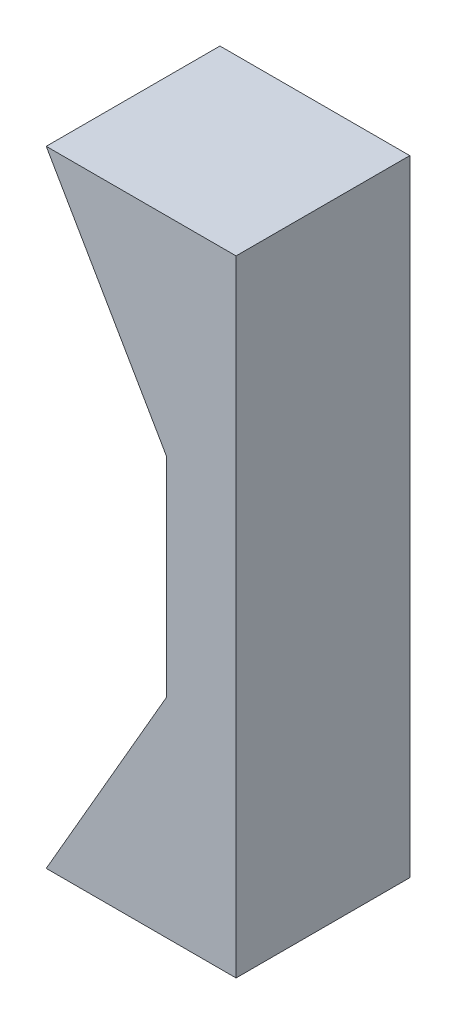
ISO-10303-21;
HEADER;
FILE_DESCRIPTION(('STEP AP214'),'2;1');
FILE_NAME('part.step','',(''),(''),'','','');
FILE_SCHEMA(('AUTOMOTIVE_DESIGN { 1 0 10303 214 1 1 1 1 }'));
ENDSEC;
DATA;
#1=APPLICATION_CONTEXT('core data for automotive mechanical design processes');
#2=APPLICATION_PROTOCOL_DEFINITION('international standard','automotive_design',2000,#1);
#3=PRODUCT_CONTEXT('',#1,'mechanical');
#4=PRODUCT('Part','Part','',(#3));
#5=PRODUCT_RELATED_PRODUCT_CATEGORY('part','',(#4));
#6=PRODUCT_DEFINITION_FORMATION('','',#4);
#7=PRODUCT_DEFINITION_CONTEXT('part definition',#1,'design');
#8=PRODUCT_DEFINITION('design','',#6,#7);
#9=PRODUCT_DEFINITION_SHAPE('','',#8);
#10=(LENGTH_UNIT() NAMED_UNIT(*) SI_UNIT(.MILLI.,.METRE.));
#11=(NAMED_UNIT(*) PLANE_ANGLE_UNIT() SI_UNIT($,.RADIAN.));
#12=(NAMED_UNIT(*) SI_UNIT($,.STERADIAN.) SOLID_ANGLE_UNIT());
#13=UNCERTAINTY_MEASURE_WITH_UNIT(LENGTH_MEASURE(1.E-05),#10,'distance_accuracy_value','');
#14=(GEOMETRIC_REPRESENTATION_CONTEXT(3) GLOBAL_UNCERTAINTY_ASSIGNED_CONTEXT((#13)) GLOBAL_UNIT_ASSIGNED_CONTEXT((#10,
#11,#12)) REPRESENTATION_CONTEXT('',''));
#15=CARTESIAN_POINT('',(0.,0.,0.));
#16=DIRECTION('',(0.,0.,1.));
#17=DIRECTION('',(1.,0.,0.));
#18=AXIS2_PLACEMENT_3D('',#15,#16,#17);
#19=CARTESIAN_POINT('',(0.,-30.,50.));
#20=DIRECTION('',(0.866025403784441,-0.499999999999995,0.));
#21=DIRECTION('',(0.499999999999995,0.866025403784442,0.));
#22=AXIS2_PLACEMENT_3D('',#19,#20,#21);
#23=PLANE('',#22);
#24=DIRECTION('',(-0.499999999999995,-0.866025403784441,0.));
#25=VECTOR('',#24,1.);
#26=CARTESIAN_POINT('',(0.,-30.,0.));
#27=LINE('',#26,#25);
#28=CARTESIAN_POINT('',(0.,-30.,0.));
#29=VERTEX_POINT('',#28);
#30=CARTESIAN_POINT('',(-34.6410161513771,-90.,0.));
#31=VERTEX_POINT('',#30);
#32=EDGE_CURVE('E116',#29,#31,#27,.T.);
#33=ORIENTED_EDGE('',*,*,#32,.T.);
#34=DIRECTION('',(0.,0.,-1.));
#35=VECTOR('',#34,1.);
#36=CARTESIAN_POINT('',(-34.6410161513771,-90.,50.));
#37=LINE('',#36,#35);
#38=CARTESIAN_POINT('',(-34.6410161513771,-90.,50.));
#39=VERTEX_POINT('',#38);
#40=EDGE_CURVE('E11',#39,#31,#37,.T.);
#41=ORIENTED_EDGE('',*,*,#40,.F.);
#42=DIRECTION('',(-0.499999999999995,-0.866025403784441,0.));
#43=VECTOR('',#42,1.);
#44=CARTESIAN_POINT('',(0.,-30.,50.));
#45=LINE('',#44,#43);
#46=CARTESIAN_POINT('',(0.,-30.,50.));
#47=VERTEX_POINT('',#46);
#48=EDGE_CURVE('E127',#47,#39,#45,.T.);
#49=ORIENTED_EDGE('',*,*,#48,.F.);
#50=DIRECTION('',(0.,0.,-1.));
#51=VECTOR('',#50,1.);
#52=CARTESIAN_POINT('',(0.,-30.,50.));
#53=LINE('',#52,#51);
#54=EDGE_CURVE('E112',#47,#29,#53,.T.);
#55=ORIENTED_EDGE('',*,*,#54,.T.);
#56=EDGE_LOOP('',(#33,#41,#49,#55));
#57=FACE_BOUND('',#56,.T.);
#58=ADVANCED_FACE('F33',(#57),#23,.F.);
#59=CARTESIAN_POINT('',(20.,-90.,50.));
#60=DIRECTION('',(0.,1.,0.));
#61=DIRECTION('',(0.,0.,1.));
#62=AXIS2_PLACEMENT_3D('',#59,#60,#61);
#63=PLANE('',#62);
#64=DIRECTION('',(1.,0.,0.));
#65=VECTOR('',#64,1.);
#66=CARTESIAN_POINT('',(20.,-90.,0.));
#67=LINE('',#66,#65);
#68=CARTESIAN_POINT('',(20.,-90.,0.));
#69=VERTEX_POINT('',#68);
#70=EDGE_CURVE('E119',#31,#69,#67,.T.);
#71=ORIENTED_EDGE('',*,*,#70,.T.);
#72=DIRECTION('',(0.,0.,-1.));
#73=VECTOR('',#72,1.);
#74=CARTESIAN_POINT('',(20.,-90.,50.));
#75=LINE('',#74,#73);
#76=CARTESIAN_POINT('',(20.,-90.,50.));
#77=VERTEX_POINT('',#76);
#78=EDGE_CURVE('E41',#77,#69,#75,.T.);
#79=ORIENTED_EDGE('',*,*,#78,.F.);
#80=DIRECTION('',(1.,0.,0.));
#81=VECTOR('',#80,1.);
#82=CARTESIAN_POINT('',(-34.6410161513771,-90.,50.));
#83=LINE('',#82,#81);
#84=EDGE_CURVE('E86',#39,#77,#83,.T.);
#85=ORIENTED_EDGE('',*,*,#84,.F.);
#86=ORIENTED_EDGE('',*,*,#40,.T.);
#87=EDGE_LOOP('',(#71,#79,#85,#86));
#88=FACE_BOUND('',#87,.T.);
#89=ADVANCED_FACE('F151',(#88),#63,.F.);
#90=CARTESIAN_POINT('',(20.,90.,50.));
#91=DIRECTION('',(-1.,0.,0.));
#92=DIRECTION('',(0.,0.,1.));
#93=AXIS2_PLACEMENT_3D('',#90,#91,#92);
#94=PLANE('',#93);
#95=DIRECTION('',(0.,1.,0.));
#96=VECTOR('',#95,1.);
#97=CARTESIAN_POINT('',(20.,90.,0.));
#98=LINE('',#97,#96);
#99=CARTESIAN_POINT('',(20.,90.,0.));
#100=VERTEX_POINT('',#99);
#101=EDGE_CURVE('E121',#69,#100,#98,.T.);
#102=ORIENTED_EDGE('',*,*,#101,.T.);
#103=DIRECTION('',(0.,0.,-1.));
#104=VECTOR('',#103,1.);
#105=CARTESIAN_POINT('',(20.,90.,50.));
#106=LINE('',#105,#104);
#107=CARTESIAN_POINT('',(20.,90.,50.));
#108=VERTEX_POINT('',#107);
#109=EDGE_CURVE('E107',#108,#100,#106,.T.);
#110=ORIENTED_EDGE('',*,*,#109,.F.);
#111=DIRECTION('',(0.,1.,0.));
#112=VECTOR('',#111,1.);
#113=CARTESIAN_POINT('',(20.,90.,50.));
#114=LINE('',#113,#112);
#115=EDGE_CURVE('E99',#77,#108,#114,.T.);
#116=ORIENTED_EDGE('',*,*,#115,.F.);
#117=ORIENTED_EDGE('',*,*,#78,.T.);
#118=EDGE_LOOP('',(#102,#110,#116,#117));
#119=FACE_BOUND('',#118,.T.);
#120=ADVANCED_FACE('F133',(#119),#94,.F.);
#121=CARTESIAN_POINT('',(-34.6410161513771,90.,50.));
#122=DIRECTION('',(0.,-1.,0.));
#123=DIRECTION('',(0.,0.,-1.));
#124=AXIS2_PLACEMENT_3D('',#121,#122,#123);
#125=PLANE('',#124);
#126=DIRECTION('',(-1.,0.,0.));
#127=VECTOR('',#126,1.);
#128=CARTESIAN_POINT('',(-34.6410161513771,90.,0.));
#129=LINE('',#128,#127);
#130=CARTESIAN_POINT('',(-34.6410161513771,90.,0.));
#131=VERTEX_POINT('',#130);
#132=EDGE_CURVE('E106',#100,#131,#129,.T.);
#133=ORIENTED_EDGE('',*,*,#132,.T.);
#134=DIRECTION('',(0.,0.,-1.));
#135=VECTOR('',#134,1.);
#136=CARTESIAN_POINT('',(-34.6410161513771,90.,50.));
#137=LINE('',#136,#135);
#138=CARTESIAN_POINT('',(-34.6410161513771,90.,50.));
#139=VERTEX_POINT('',#138);
#140=EDGE_CURVE('E104',#139,#131,#137,.T.);
#141=ORIENTED_EDGE('',*,*,#140,.F.);
#142=DIRECTION('',(-1.,0.,0.));
#143=VECTOR('',#142,1.);
#144=CARTESIAN_POINT('',(0.,90.,50.));
#145=LINE('',#144,#143);
#146=EDGE_CURVE('E93',#108,#139,#145,.T.);
#147=ORIENTED_EDGE('',*,*,#146,.F.);
#148=ORIENTED_EDGE('',*,*,#109,.T.);
#149=EDGE_LOOP('',(#133,#141,#147,#148));
#150=FACE_BOUND('',#149,.T.);
#151=ADVANCED_FACE('F105',(#150),#125,.F.);
#152=CARTESIAN_POINT('',(0.,30.,50.));
#153=DIRECTION('',(0.866025403784441,0.499999999999995,0.));
#154=DIRECTION('',(-0.499999999999995,0.866025403784441,0.));
#155=AXIS2_PLACEMENT_3D('',#152,#153,#154);
#156=PLANE('',#155);
#157=DIRECTION('',(0.499999999999995,-0.866025403784441,0.));
#158=VECTOR('',#157,1.);
#159=CARTESIAN_POINT('',(0.,30.,0.));
#160=LINE('',#159,#158);
#161=CARTESIAN_POINT('',(0.,30.,0.));
#162=VERTEX_POINT('',#161);
#163=EDGE_CURVE('E72',#131,#162,#160,.T.);
#164=ORIENTED_EDGE('',*,*,#163,.T.);
#165=DIRECTION('',(0.,0.,-1.));
#166=VECTOR('',#165,1.);
#167=CARTESIAN_POINT('',(0.,30.,50.));
#168=LINE('',#167,#166);
#169=CARTESIAN_POINT('',(0.,30.,50.));
#170=VERTEX_POINT('',#169);
#171=EDGE_CURVE('E108',#170,#162,#168,.T.);
#172=ORIENTED_EDGE('',*,*,#171,.F.);
#173=DIRECTION('',(0.499999999999995,-0.866025403784441,0.));
#174=VECTOR('',#173,1.);
#175=CARTESIAN_POINT('',(0.,30.,50.));
#176=LINE('',#175,#174);
#177=EDGE_CURVE('E97',#139,#170,#176,.T.);
#178=ORIENTED_EDGE('',*,*,#177,.F.);
#179=ORIENTED_EDGE('',*,*,#140,.T.);
#180=EDGE_LOOP('',(#164,#172,#178,#179));
#181=FACE_BOUND('',#180,.T.);
#182=ADVANCED_FACE('F110',(#181),#156,.F.);
#183=CARTESIAN_POINT('',(0.,30.,50.));
#184=DIRECTION('',(1.,0.,0.));
#185=DIRECTION('',(0.,0.,-1.));
#186=AXIS2_PLACEMENT_3D('',#183,#184,#185);
#187=PLANE('',#186);
#188=DIRECTION('',(0.,-1.,0.));
#189=VECTOR('',#188,1.);
#190=CARTESIAN_POINT('',(0.,30.,0.));
#191=LINE('',#190,#189);
#192=EDGE_CURVE('E78',#162,#29,#191,.T.);
#193=ORIENTED_EDGE('',*,*,#192,.T.);
#194=ORIENTED_EDGE('',*,*,#54,.F.);
#195=DIRECTION('',(0.,-1.,0.));
#196=VECTOR('',#195,1.);
#197=CARTESIAN_POINT('',(0.,30.,50.));
#198=LINE('',#197,#196);
#199=EDGE_CURVE('E49',#170,#47,#198,.T.);
#200=ORIENTED_EDGE('',*,*,#199,.F.);
#201=ORIENTED_EDGE('',*,*,#171,.T.);
#202=EDGE_LOOP('',(#193,#194,#200,#201));
#203=FACE_BOUND('',#202,.T.);
#204=ADVANCED_FACE('F140',(#203),#187,.F.);
#205=CARTESIAN_POINT('',(0.,0.,50.));
#206=DIRECTION('',(0.,0.,1.));
#207=DIRECTION('',(1.,0.,0.));
#208=AXIS2_PLACEMENT_3D('',#205,#206,#207);
#209=PLANE('',#208);
#210=ORIENTED_EDGE('',*,*,#48,.T.);
#211=ORIENTED_EDGE('',*,*,#84,.T.);
#212=ORIENTED_EDGE('',*,*,#115,.T.);
#213=ORIENTED_EDGE('',*,*,#146,.T.);
#214=ORIENTED_EDGE('',*,*,#177,.T.);
#215=ORIENTED_EDGE('',*,*,#199,.T.);
#216=EDGE_LOOP('',(#210,#211,#212,#213,#214,#215));
#217=FACE_BOUND('',#216,.T.);
#218=ADVANCED_FACE('F95',(#217),#209,.T.);
#219=CARTESIAN_POINT('',(0.,0.,0.));
#220=DIRECTION('',(0.,0.,1.));
#221=DIRECTION('',(1.,0.,0.));
#222=AXIS2_PLACEMENT_3D('',#219,#220,#221);
#223=PLANE('',#222);
#224=ORIENTED_EDGE('',*,*,#32,.F.);
#225=ORIENTED_EDGE('',*,*,#192,.F.);
#226=ORIENTED_EDGE('',*,*,#163,.F.);
#227=ORIENTED_EDGE('',*,*,#132,.F.);
#228=ORIENTED_EDGE('',*,*,#101,.F.);
#229=ORIENTED_EDGE('',*,*,#70,.F.);
#230=EDGE_LOOP('',(#224,#225,#226,#227,#228,#229));
#231=FACE_BOUND('',#230,.T.);
#232=ADVANCED_FACE('F136',(#231),#223,.F.);
#233=CLOSED_SHELL('',(#58,#89,#120,#151,#182,#204,#218,#232));
#234=MANIFOLD_SOLID_BREP('B2',#233);
#235=ADVANCED_BREP_SHAPE_REPRESENTATION('',(#18,#234),#14);
#236=SHAPE_DEFINITION_REPRESENTATION(#9,#235);
ENDSEC;
END-ISO-10303-21;
